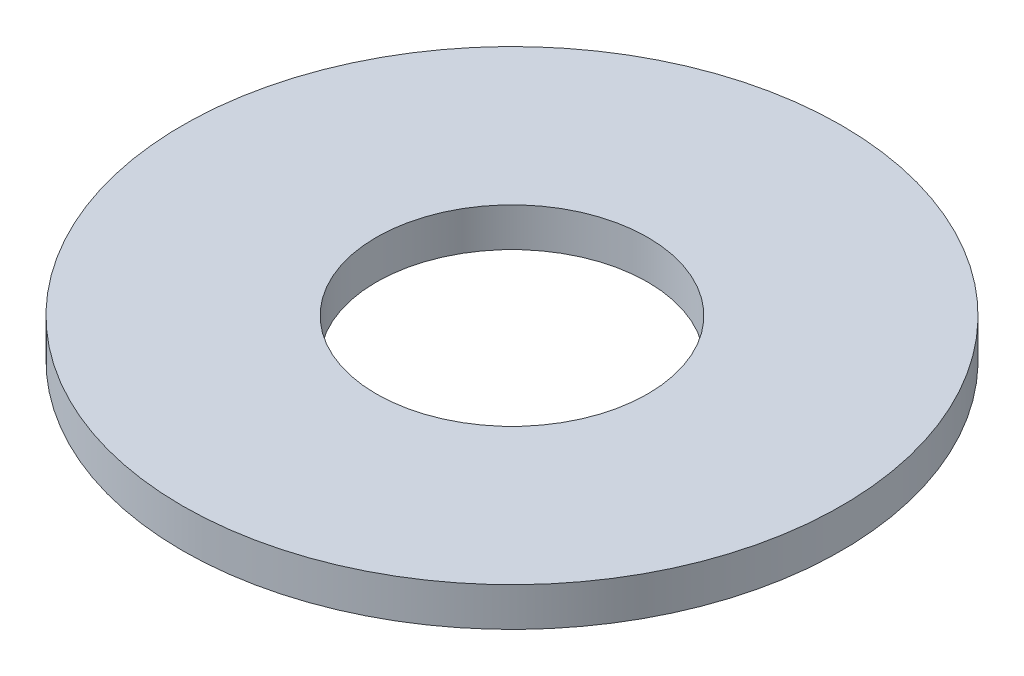
ISO-10303-21;
HEADER;
FILE_DESCRIPTION(('STEP AP214'),'2;1');
FILE_NAME('part.step','',(''),(''),'','','');
FILE_SCHEMA(('AUTOMOTIVE_DESIGN { 1 0 10303 214 1 1 1 1 }'));
ENDSEC;
DATA;
#1=APPLICATION_CONTEXT('core data for automotive mechanical design processes');
#2=APPLICATION_PROTOCOL_DEFINITION('international standard','automotive_design',2000,#1);
#3=PRODUCT_CONTEXT('',#1,'mechanical');
#4=PRODUCT('Part','Part','',(#3));
#5=PRODUCT_RELATED_PRODUCT_CATEGORY('part','',(#4));
#6=PRODUCT_DEFINITION_FORMATION('','',#4);
#7=PRODUCT_DEFINITION_CONTEXT('part definition',#1,'design');
#8=PRODUCT_DEFINITION('design','',#6,#7);
#9=PRODUCT_DEFINITION_SHAPE('','',#8);
#10=(LENGTH_UNIT() NAMED_UNIT(*) SI_UNIT(.MILLI.,.METRE.));
#11=(NAMED_UNIT(*) PLANE_ANGLE_UNIT() SI_UNIT($,.RADIAN.));
#12=(NAMED_UNIT(*) SI_UNIT($,.STERADIAN.) SOLID_ANGLE_UNIT());
#13=UNCERTAINTY_MEASURE_WITH_UNIT(LENGTH_MEASURE(1.E-05),#10,'distance_accuracy_value','');
#14=(GEOMETRIC_REPRESENTATION_CONTEXT(3) GLOBAL_UNCERTAINTY_ASSIGNED_CONTEXT((#13)) GLOBAL_UNIT_ASSIGNED_CONTEXT((#10,
#11,#12)) REPRESENTATION_CONTEXT('',''));
#15=CARTESIAN_POINT('',(0.,0.,0.));
#16=DIRECTION('',(0.,0.,1.));
#17=DIRECTION('',(1.,0.,0.));
#18=AXIS2_PLACEMENT_3D('',#15,#16,#17);
#19=CARTESIAN_POINT('',(-44.625,33.125,0.));
#20=DIRECTION('',(0.,-1.,0.));
#21=DIRECTION('',(0.,0.,-1.));
#22=AXIS2_PLACEMENT_3D('',#19,#20,#21);
#23=PLANE('',#22);
#24=CARTESIAN_POINT('',(0.,33.125,0.));
#25=DIRECTION('',(0.,1.,0.));
#26=DIRECTION('',(0.,0.,1.));
#27=AXIS2_PLACEMENT_3D('',#24,#25,#26);
#28=CIRCLE('',#27,18.375);
#29=CARTESIAN_POINT('',(0.,33.125,18.375));
#30=VERTEX_POINT('',#29);
#31=EDGE_CURVE('E46',#30,#30,#28,.T.);
#32=ORIENTED_EDGE('',*,*,#31,.T.);
#33=EDGE_LOOP('',(#32));
#34=FACE_BOUND('',#33,.T.);
#35=CARTESIAN_POINT('',(0.,33.125,0.));
#36=DIRECTION('',(0.,1.,0.));
#37=DIRECTION('',(0.,0.,1.));
#38=AXIS2_PLACEMENT_3D('',#35,#36,#37);
#39=CIRCLE('',#38,44.625);
#40=CARTESIAN_POINT('',(0.,33.125,44.625));
#41=VERTEX_POINT('',#40);
#42=EDGE_CURVE('E37',#41,#41,#39,.T.);
#43=ORIENTED_EDGE('',*,*,#42,.F.);
#44=EDGE_LOOP('',(#43));
#45=FACE_BOUND('',#44,.T.);
#46=ADVANCED_FACE('F34',(#34,#45),#23,.T.);
#47=CARTESIAN_POINT('',(0.,35.75,0.));
#48=DIRECTION('',(0.,1.,0.));
#49=DIRECTION('',(0.,0.,1.));
#50=AXIS2_PLACEMENT_3D('',#47,#48,#49);
#51=CYLINDRICAL_SURFACE('',#50,44.625);
#52=CARTESIAN_POINT('',(0.,38.375,0.));
#53=DIRECTION('',(0.,1.,0.));
#54=DIRECTION('',(0.,0.,1.));
#55=AXIS2_PLACEMENT_3D('',#52,#53,#54);
#56=CIRCLE('',#55,44.625);
#57=CARTESIAN_POINT('',(0.,38.375,44.625));
#58=VERTEX_POINT('',#57);
#59=EDGE_CURVE('E41',#58,#58,#56,.T.);
#60=ORIENTED_EDGE('',*,*,#59,.F.);
#61=EDGE_LOOP('',(#60));
#62=FACE_BOUND('',#61,.T.);
#63=ORIENTED_EDGE('',*,*,#42,.T.);
#64=EDGE_LOOP('',(#63));
#65=FACE_BOUND('',#64,.T.);
#66=ADVANCED_FACE('F54',(#62,#65),#51,.T.);
#67=CARTESIAN_POINT('',(0.,35.75,0.));
#68=DIRECTION('',(0.,1.,0.));
#69=DIRECTION('',(0.,0.,1.));
#70=AXIS2_PLACEMENT_3D('',#67,#68,#69);
#71=CYLINDRICAL_SURFACE('',#70,18.375);
#72=ORIENTED_EDGE('',*,*,#31,.F.);
#73=EDGE_LOOP('',(#72));
#74=FACE_BOUND('',#73,.T.);
#75=CARTESIAN_POINT('',(0.,38.375,0.));
#76=DIRECTION('',(0.,1.,0.));
#77=DIRECTION('',(0.,0.,1.));
#78=AXIS2_PLACEMENT_3D('',#75,#76,#77);
#79=CIRCLE('',#78,18.375);
#80=CARTESIAN_POINT('',(0.,38.375,18.375));
#81=VERTEX_POINT('',#80);
#82=EDGE_CURVE('E10',#81,#81,#79,.F.);
#83=ORIENTED_EDGE('',*,*,#82,.F.);
#84=EDGE_LOOP('',(#83));
#85=FACE_BOUND('',#84,.T.);
#86=ADVANCED_FACE('F60',(#74,#85),#71,.F.);
#87=CARTESIAN_POINT('',(-18.375,38.375,0.));
#88=DIRECTION('',(0.,1.,0.));
#89=DIRECTION('',(0.,0.,1.));
#90=AXIS2_PLACEMENT_3D('',#87,#88,#89);
#91=PLANE('',#90);
#92=ORIENTED_EDGE('',*,*,#82,.T.);
#93=EDGE_LOOP('',(#92));
#94=FACE_BOUND('',#93,.T.);
#95=ORIENTED_EDGE('',*,*,#59,.T.);
#96=EDGE_LOOP('',(#95));
#97=FACE_BOUND('',#96,.T.);
#98=ADVANCED_FACE('F62',(#94,#97),#91,.T.);
#99=CLOSED_SHELL('',(#46,#66,#86,#98));
#100=MANIFOLD_SOLID_BREP('B2',#99);
#101=ADVANCED_BREP_SHAPE_REPRESENTATION('',(#18,#100),#14);
#102=SHAPE_DEFINITION_REPRESENTATION(#9,#101);
ENDSEC;
END-ISO-10303-21;
